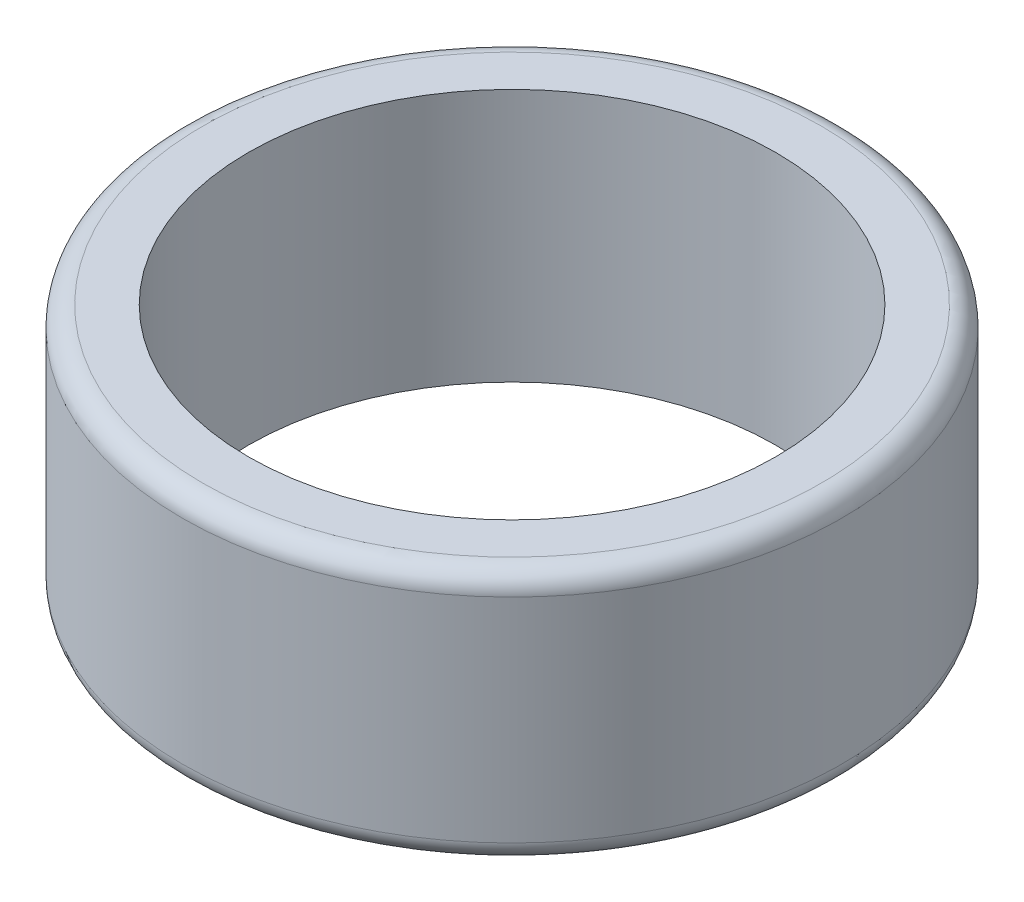
ISO-10303-21;
HEADER;
FILE_DESCRIPTION(('STEP AP214'),'2;1');
FILE_NAME('part.step','',(''),(''),'','','');
FILE_SCHEMA(('AUTOMOTIVE_DESIGN { 1 0 10303 214 1 1 1 1 }'));
ENDSEC;
DATA;
#1=APPLICATION_CONTEXT('core data for automotive mechanical design processes');
#2=APPLICATION_PROTOCOL_DEFINITION('international standard','automotive_design',2000,#1);
#3=PRODUCT_CONTEXT('',#1,'mechanical');
#4=PRODUCT('Part','Part','',(#3));
#5=PRODUCT_RELATED_PRODUCT_CATEGORY('part','',(#4));
#6=PRODUCT_DEFINITION_FORMATION('','',#4);
#7=PRODUCT_DEFINITION_CONTEXT('part definition',#1,'design');
#8=PRODUCT_DEFINITION('design','',#6,#7);
#9=PRODUCT_DEFINITION_SHAPE('','',#8);
#10=(LENGTH_UNIT() NAMED_UNIT(*) SI_UNIT(.MILLI.,.METRE.));
#11=(NAMED_UNIT(*) PLANE_ANGLE_UNIT() SI_UNIT($,.RADIAN.));
#12=(NAMED_UNIT(*) SI_UNIT($,.STERADIAN.) SOLID_ANGLE_UNIT());
#13=UNCERTAINTY_MEASURE_WITH_UNIT(LENGTH_MEASURE(1.E-05),#10,'distance_accuracy_value','');
#14=(GEOMETRIC_REPRESENTATION_CONTEXT(3) GLOBAL_UNCERTAINTY_ASSIGNED_CONTEXT((#13)) GLOBAL_UNIT_ASSIGNED_CONTEXT((#10,
#11,#12)) REPRESENTATION_CONTEXT('',''));
#15=CARTESIAN_POINT('',(0.,0.,0.));
#16=DIRECTION('',(0.,0.,1.));
#17=DIRECTION('',(1.,0.,0.));
#18=AXIS2_PLACEMENT_3D('',#15,#16,#17);
#19=CARTESIAN_POINT('',(0.,25.,0.));
#20=DIRECTION('',(0.,1.,0.));
#21=DIRECTION('',(0.,0.,1.));
#22=AXIS2_PLACEMENT_3D('',#19,#20,#21);
#23=PLANE('',#22);
#24=CARTESIAN_POINT('',(0.,25.,0.));
#25=DIRECTION('',(0.,1.,0.));
#26=DIRECTION('',(0.,0.,1.));
#27=AXIS2_PLACEMENT_3D('',#24,#25,#26);
#28=CIRCLE('',#27,30.5);
#29=CARTESIAN_POINT('',(0.,25.,30.5));
#30=VERTEX_POINT('',#29);
#31=EDGE_CURVE('E46',#30,#30,#28,.T.);
#32=ORIENTED_EDGE('',*,*,#31,.T.);
#33=EDGE_LOOP('',(#32));
#34=FACE_BOUND('',#33,.T.);
#35=CARTESIAN_POINT('',(0.,25.,0.));
#36=DIRECTION('',(0.,1.,0.));
#37=DIRECTION('',(0.,0.,1.));
#38=AXIS2_PLACEMENT_3D('',#35,#36,#37);
#39=CIRCLE('',#38,26.);
#40=CARTESIAN_POINT('',(0.,25.,26.));
#41=VERTEX_POINT('',#40);
#42=EDGE_CURVE('E51',#41,#41,#39,.T.);
#43=ORIENTED_EDGE('',*,*,#42,.F.);
#44=EDGE_LOOP('',(#43));
#45=FACE_BOUND('',#44,.T.);
#46=ADVANCED_FACE('F31',(#34,#45),#23,.T.);
#47=CARTESIAN_POINT('',(0.,0.,0.));
#48=DIRECTION('',(0.,1.,0.));
#49=DIRECTION('',(0.,0.,1.));
#50=AXIS2_PLACEMENT_3D('',#47,#48,#49);
#51=PLANE('',#50);
#52=CARTESIAN_POINT('',(0.,0.,0.));
#53=DIRECTION('',(0.,1.,0.));
#54=DIRECTION('',(0.,0.,1.));
#55=AXIS2_PLACEMENT_3D('',#52,#53,#54);
#56=CIRCLE('',#55,30.5);
#57=CARTESIAN_POINT('',(0.,0.,30.5));
#58=VERTEX_POINT('',#57);
#59=EDGE_CURVE('E10',#58,#58,#56,.F.);
#60=ORIENTED_EDGE('',*,*,#59,.T.);
#61=EDGE_LOOP('',(#60));
#62=FACE_BOUND('',#61,.T.);
#63=CARTESIAN_POINT('',(0.,0.,0.));
#64=DIRECTION('',(0.,1.,0.));
#65=DIRECTION('',(0.,0.,1.));
#66=AXIS2_PLACEMENT_3D('',#63,#64,#65);
#67=CIRCLE('',#66,26.);
#68=CARTESIAN_POINT('',(0.,0.,26.));
#69=VERTEX_POINT('',#68);
#70=EDGE_CURVE('E52',#69,#69,#67,.T.);
#71=ORIENTED_EDGE('',*,*,#70,.T.);
#72=EDGE_LOOP('',(#71));
#73=FACE_BOUND('',#72,.T.);
#74=ADVANCED_FACE('F62',(#62,#73),#51,.F.);
#75=CARTESIAN_POINT('',(0.,25.,0.));
#76=DIRECTION('',(0.,-1.,0.));
#77=DIRECTION('',(0.,0.,-1.));
#78=AXIS2_PLACEMENT_3D('',#75,#76,#77);
#79=CYLINDRICAL_SURFACE('',#78,32.5);
#80=CARTESIAN_POINT('',(0.,23.,0.));
#81=DIRECTION('',(0.,1.,0.));
#82=DIRECTION('',(0.,0.,1.));
#83=AXIS2_PLACEMENT_3D('',#80,#81,#82);
#84=CIRCLE('',#83,32.5);
#85=CARTESIAN_POINT('',(0.,23.,32.5));
#86=VERTEX_POINT('',#85);
#87=EDGE_CURVE('E38',#86,#86,#84,.F.);
#88=ORIENTED_EDGE('',*,*,#87,.T.);
#89=EDGE_LOOP('',(#88));
#90=FACE_BOUND('',#89,.T.);
#91=CARTESIAN_POINT('',(0.,2.,0.));
#92=DIRECTION('',(0.,1.,0.));
#93=DIRECTION('',(0.,0.,1.));
#94=AXIS2_PLACEMENT_3D('',#91,#92,#93);
#95=CIRCLE('',#94,32.5);
#96=CARTESIAN_POINT('',(0.,2.,32.5));
#97=VERTEX_POINT('',#96);
#98=EDGE_CURVE('E42',#97,#97,#95,.T.);
#99=ORIENTED_EDGE('',*,*,#98,.T.);
#100=EDGE_LOOP('',(#99));
#101=FACE_BOUND('',#100,.T.);
#102=ADVANCED_FACE('F68',(#90,#101),#79,.T.);
#103=CARTESIAN_POINT('',(0.,25.,0.));
#104=DIRECTION('',(0.,-1.,0.));
#105=DIRECTION('',(0.,0.,-1.));
#106=AXIS2_PLACEMENT_3D('',#103,#104,#105);
#107=CYLINDRICAL_SURFACE('',#106,26.);
#108=ORIENTED_EDGE('',*,*,#42,.T.);
#109=EDGE_LOOP('',(#108));
#110=FACE_BOUND('',#109,.T.);
#111=ORIENTED_EDGE('',*,*,#70,.F.);
#112=EDGE_LOOP('',(#111));
#113=FACE_BOUND('',#112,.T.);
#114=ADVANCED_FACE('F58',(#110,#113),#107,.F.);
#115=CARTESIAN_POINT('',(0.,23.,0.));
#116=DIRECTION('',(0.,1.,0.));
#117=DIRECTION('',(0.,0.,1.));
#118=AXIS2_PLACEMENT_3D('',#115,#116,#117);
#119=TOROIDAL_SURFACE('',#118,30.5,2.);
#120=ORIENTED_EDGE('',*,*,#87,.F.);
#121=EDGE_LOOP('',(#120));
#122=FACE_BOUND('',#121,.T.);
#123=ORIENTED_EDGE('',*,*,#31,.F.);
#124=EDGE_LOOP('',(#123));
#125=FACE_BOUND('',#124,.T.);
#126=ADVANCED_FACE('F73',(#122,#125),#119,.T.);
#127=CARTESIAN_POINT('',(0.,2.,0.));
#128=DIRECTION('',(0.,1.,0.));
#129=DIRECTION('',(0.,0.,1.));
#130=AXIS2_PLACEMENT_3D('',#127,#128,#129);
#131=TOROIDAL_SURFACE('',#130,30.5,2.);
#132=ORIENTED_EDGE('',*,*,#59,.F.);
#133=EDGE_LOOP('',(#132));
#134=FACE_BOUND('',#133,.T.);
#135=ORIENTED_EDGE('',*,*,#98,.F.);
#136=EDGE_LOOP('',(#135));
#137=FACE_BOUND('',#136,.T.);
#138=ADVANCED_FACE('F33',(#134,#137),#131,.T.);
#139=CLOSED_SHELL('',(#46,#74,#102,#114,#126,#138));
#140=MANIFOLD_SOLID_BREP('B2',#139);
#141=ADVANCED_BREP_SHAPE_REPRESENTATION('',(#18,#140),#14);
#142=SHAPE_DEFINITION_REPRESENTATION(#9,#141);
ENDSEC;
END-ISO-10303-21;
